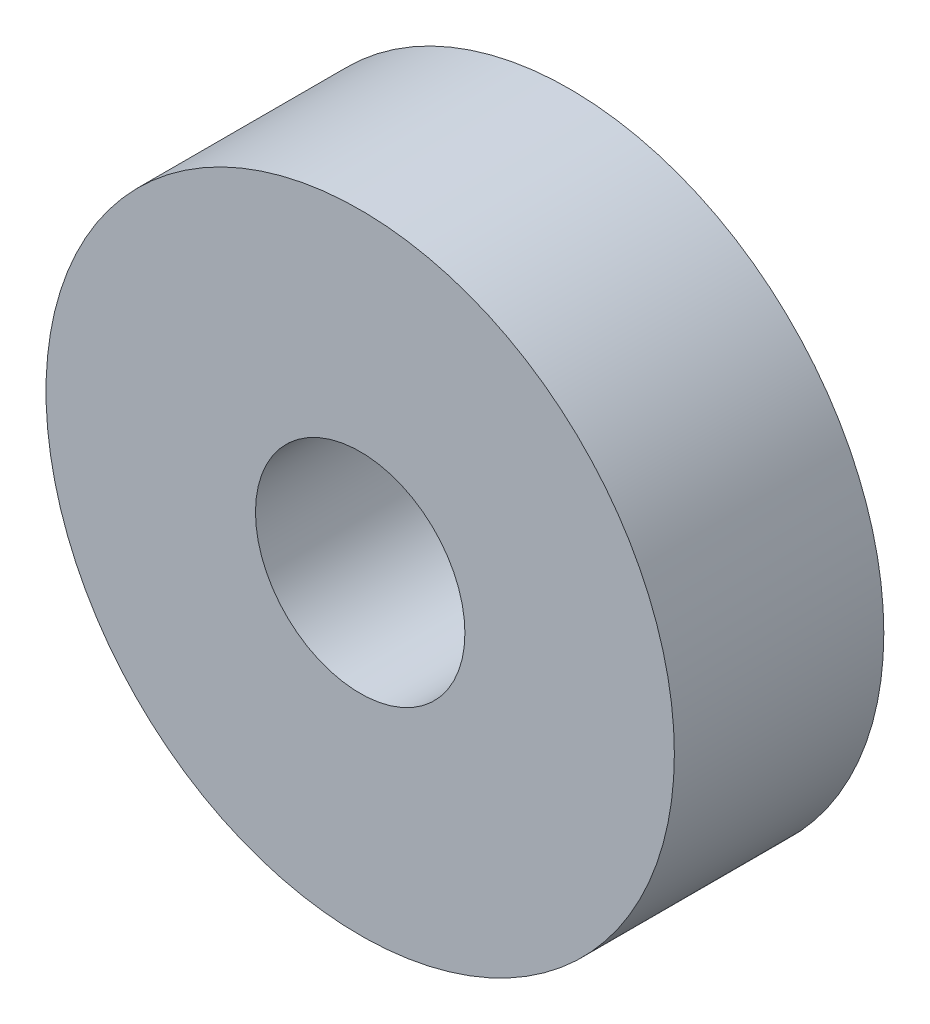
ISO-10303-21;
HEADER;
FILE_DESCRIPTION(('STEP AP214'),'2;1');
FILE_NAME('part.step','',(''),(''),'','','');
FILE_SCHEMA(('AUTOMOTIVE_DESIGN { 1 0 10303 214 1 1 1 1 }'));
ENDSEC;
DATA;
#1=APPLICATION_CONTEXT('core data for automotive mechanical design processes');
#2=APPLICATION_PROTOCOL_DEFINITION('international standard','automotive_design',2000,#1);
#3=PRODUCT_CONTEXT('',#1,'mechanical');
#4=PRODUCT('Part','Part','',(#3));
#5=PRODUCT_RELATED_PRODUCT_CATEGORY('part','',(#4));
#6=PRODUCT_DEFINITION_FORMATION('','',#4);
#7=PRODUCT_DEFINITION_CONTEXT('part definition',#1,'design');
#8=PRODUCT_DEFINITION('design','',#6,#7);
#9=PRODUCT_DEFINITION_SHAPE('','',#8);
#10=(LENGTH_UNIT() NAMED_UNIT(*) SI_UNIT(.MILLI.,.METRE.));
#11=(NAMED_UNIT(*) PLANE_ANGLE_UNIT() SI_UNIT($,.RADIAN.));
#12=(NAMED_UNIT(*) SI_UNIT($,.STERADIAN.) SOLID_ANGLE_UNIT());
#13=UNCERTAINTY_MEASURE_WITH_UNIT(LENGTH_MEASURE(1.E-05),#10,'distance_accuracy_value','');
#14=(GEOMETRIC_REPRESENTATION_CONTEXT(3) GLOBAL_UNCERTAINTY_ASSIGNED_CONTEXT((#13)) GLOBAL_UNIT_ASSIGNED_CONTEXT((#10,
#11,#12)) REPRESENTATION_CONTEXT('',''));
#15=CARTESIAN_POINT('',(0.,0.,0.));
#16=DIRECTION('',(0.,0.,1.));
#17=DIRECTION('',(1.,0.,0.));
#18=AXIS2_PLACEMENT_3D('',#15,#16,#17);
#19=CARTESIAN_POINT('',(0.,0.,4.));
#20=DIRECTION('',(0.,0.,1.));
#21=DIRECTION('',(1.,0.,0.));
#22=AXIS2_PLACEMENT_3D('',#19,#20,#21);
#23=PLANE('',#22);
#24=CARTESIAN_POINT('',(0.,0.,4.));
#25=DIRECTION('',(0.,0.,1.));
#26=DIRECTION('',(1.,0.,0.));
#27=AXIS2_PLACEMENT_3D('',#24,#25,#26);
#28=CIRCLE('',#27,6.);
#29=CARTESIAN_POINT('',(6.,0.,4.));
#30=VERTEX_POINT('',#29);
#31=EDGE_CURVE('E10',#30,#30,#28,.T.);
#32=ORIENTED_EDGE('',*,*,#31,.T.);
#33=EDGE_LOOP('',(#32));
#34=FACE_BOUND('',#33,.T.);
#35=CARTESIAN_POINT('',(0.,0.,4.));
#36=DIRECTION('',(0.,0.,1.));
#37=DIRECTION('',(1.,0.,0.));
#38=AXIS2_PLACEMENT_3D('',#35,#36,#37);
#39=CIRCLE('',#38,2.);
#40=CARTESIAN_POINT('',(2.,0.,4.));
#41=VERTEX_POINT('',#40);
#42=EDGE_CURVE('E44',#41,#41,#39,.T.);
#43=ORIENTED_EDGE('',*,*,#42,.F.);
#44=EDGE_LOOP('',(#43));
#45=FACE_BOUND('',#44,.T.);
#46=ADVANCED_FACE('F33',(#34,#45),#23,.T.);
#47=CARTESIAN_POINT('',(0.,0.,0.));
#48=DIRECTION('',(0.,0.,1.));
#49=DIRECTION('',(1.,0.,0.));
#50=AXIS2_PLACEMENT_3D('',#47,#48,#49);
#51=PLANE('',#50);
#52=CARTESIAN_POINT('',(0.,0.,0.));
#53=DIRECTION('',(0.,0.,1.));
#54=DIRECTION('',(1.,0.,0.));
#55=AXIS2_PLACEMENT_3D('',#52,#53,#54);
#56=CIRCLE('',#55,6.);
#57=CARTESIAN_POINT('',(6.,0.,0.));
#58=VERTEX_POINT('',#57);
#59=EDGE_CURVE('E37',#58,#58,#56,.T.);
#60=ORIENTED_EDGE('',*,*,#59,.F.);
#61=EDGE_LOOP('',(#60));
#62=FACE_BOUND('',#61,.T.);
#63=CARTESIAN_POINT('',(0.,0.,0.));
#64=DIRECTION('',(0.,0.,1.));
#65=DIRECTION('',(1.,0.,0.));
#66=AXIS2_PLACEMENT_3D('',#63,#64,#65);
#67=CIRCLE('',#66,2.);
#68=CARTESIAN_POINT('',(2.,0.,0.));
#69=VERTEX_POINT('',#68);
#70=EDGE_CURVE('E46',#69,#69,#67,.T.);
#71=ORIENTED_EDGE('',*,*,#70,.T.);
#72=EDGE_LOOP('',(#71));
#73=FACE_BOUND('',#72,.T.);
#74=ADVANCED_FACE('F56',(#62,#73),#51,.F.);
#75=CARTESIAN_POINT('',(0.,0.,4.));
#76=DIRECTION('',(0.,0.,-1.));
#77=DIRECTION('',(-1.,0.,0.));
#78=AXIS2_PLACEMENT_3D('',#75,#76,#77);
#79=CYLINDRICAL_SURFACE('',#78,6.);
#80=ORIENTED_EDGE('',*,*,#31,.F.);
#81=EDGE_LOOP('',(#80));
#82=FACE_BOUND('',#81,.T.);
#83=ORIENTED_EDGE('',*,*,#59,.T.);
#84=EDGE_LOOP('',(#83));
#85=FACE_BOUND('',#84,.T.);
#86=ADVANCED_FACE('F35',(#82,#85),#79,.T.);
#87=CARTESIAN_POINT('',(0.,0.,4.));
#88=DIRECTION('',(0.,0.,-1.));
#89=DIRECTION('',(-1.,0.,0.));
#90=AXIS2_PLACEMENT_3D('',#87,#88,#89);
#91=CYLINDRICAL_SURFACE('',#90,2.);
#92=ORIENTED_EDGE('',*,*,#42,.T.);
#93=EDGE_LOOP('',(#92));
#94=FACE_BOUND('',#93,.T.);
#95=ORIENTED_EDGE('',*,*,#70,.F.);
#96=EDGE_LOOP('',(#95));
#97=FACE_BOUND('',#96,.T.);
#98=ADVANCED_FACE('F52',(#94,#97),#91,.F.);
#99=CLOSED_SHELL('',(#46,#74,#86,#98));
#100=MANIFOLD_SOLID_BREP('B2',#99);
#101=ADVANCED_BREP_SHAPE_REPRESENTATION('',(#18,#100),#14);
#102=SHAPE_DEFINITION_REPRESENTATION(#9,#101);
ENDSEC;
END-ISO-10303-21;
